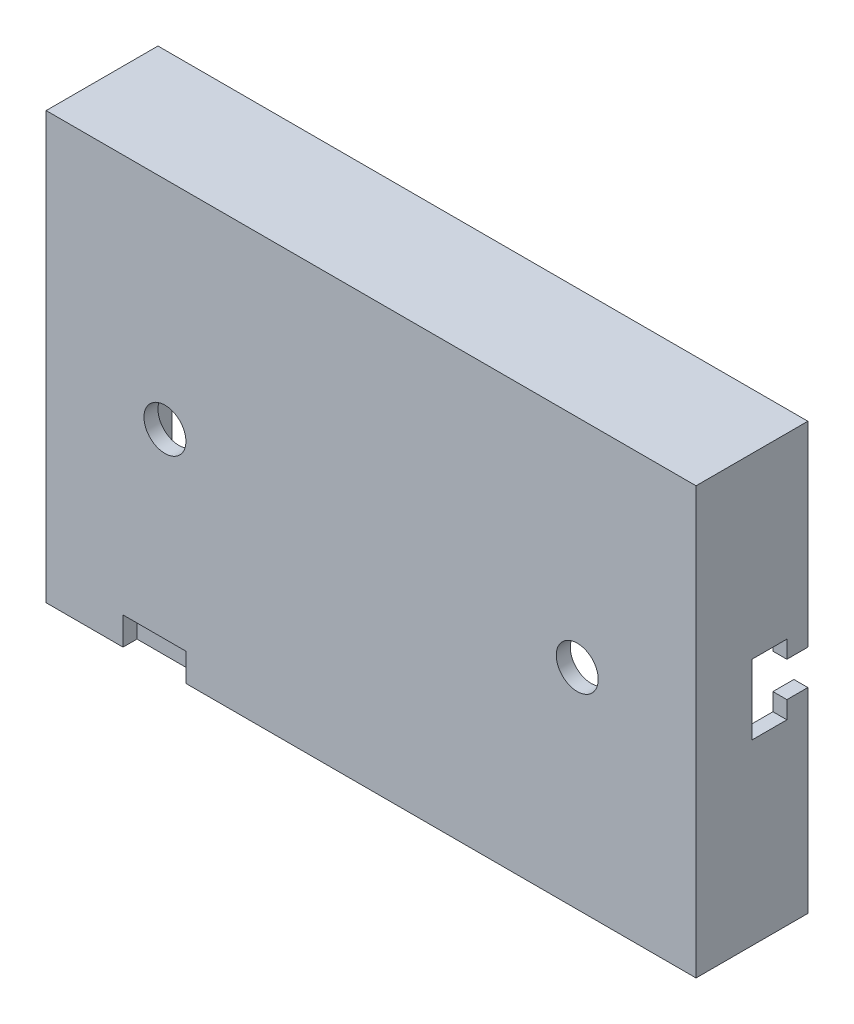
ISO-10303-21;
HEADER;
FILE_DESCRIPTION(('STEP AP214'),'2;1');
FILE_NAME('part.step','',(''),(''),'','','');
FILE_SCHEMA(('AUTOMOTIVE_DESIGN { 1 0 10303 214 1 1 1 1 }'));
ENDSEC;
DATA;
#1=APPLICATION_CONTEXT('core data for automotive mechanical design processes');
#2=APPLICATION_PROTOCOL_DEFINITION('international standard','automotive_design',2000,#1);
#3=PRODUCT_CONTEXT('',#1,'mechanical');
#4=PRODUCT('Part','Part','',(#3));
#5=PRODUCT_RELATED_PRODUCT_CATEGORY('part','',(#4));
#6=PRODUCT_DEFINITION_FORMATION('','',#4);
#7=PRODUCT_DEFINITION_CONTEXT('part definition',#1,'design');
#8=PRODUCT_DEFINITION('design','',#6,#7);
#9=PRODUCT_DEFINITION_SHAPE('','',#8);
#10=(LENGTH_UNIT() NAMED_UNIT(*) SI_UNIT(.MILLI.,.METRE.));
#11=(NAMED_UNIT(*) PLANE_ANGLE_UNIT() SI_UNIT($,.RADIAN.));
#12=(NAMED_UNIT(*) SI_UNIT($,.STERADIAN.) SOLID_ANGLE_UNIT());
#13=UNCERTAINTY_MEASURE_WITH_UNIT(LENGTH_MEASURE(1.E-05),#10,'distance_accuracy_value','');
#14=(GEOMETRIC_REPRESENTATION_CONTEXT(3) GLOBAL_UNCERTAINTY_ASSIGNED_CONTEXT((#13)) GLOBAL_UNIT_ASSIGNED_CONTEXT((#10,
#11,#12)) REPRESENTATION_CONTEXT('',''));
#15=CARTESIAN_POINT('',(0.,0.,0.));
#16=DIRECTION('',(0.,0.,1.));
#17=DIRECTION('',(1.,0.,0.));
#18=AXIS2_PLACEMENT_3D('',#15,#16,#17);
#19=CARTESIAN_POINT('',(48.6668074324324,-0.394481665967188,-11.0000011178218));
#20=DIRECTION('',(0.,0.,-1.));
#21=DIRECTION('',(0.,1.,0.));
#22=AXIS2_PLACEMENT_3D('',#19,#20,#21);
#23=PLANE('',#22);
#24=DIRECTION('',(0.,1.,0.));
#25=VECTOR('',#24,1.);
#26=CARTESIAN_POINT('',(48.6668074324324,-0.394481665967188,-11.0000011178218));
#27=LINE('',#26,#25);
#28=CARTESIAN_POINT('',(48.6668074324324,-2.89448166596719,-11.0000011178218));
#29=VERTEX_POINT('',#28);
#30=CARTESIAN_POINT('',(48.6668074324324,-0.394481665967188,-11.0000011178218));
#31=VERTEX_POINT('',#30);
#32=EDGE_CURVE('E258',#29,#31,#27,.T.);
#33=ORIENTED_EDGE('',*,*,#32,.F.);
#34=DIRECTION('',(1.,0.,0.));
#35=VECTOR('',#34,1.);
#36=CARTESIAN_POINT('',(48.6668074324324,-2.89448166596719,-11.0000011178218));
#37=LINE('',#36,#35);
#38=CARTESIAN_POINT('',(50.6668074324324,-2.89448166596719,-11.0000011178218));
#39=VERTEX_POINT('',#38);
#40=EDGE_CURVE('E235',#29,#39,#37,.T.);
#41=ORIENTED_EDGE('',*,*,#40,.T.);
#42=DIRECTION('',(0.,1.,0.));
#43=VECTOR('',#42,1.);
#44=CARTESIAN_POINT('',(50.6668074324324,-0.394481665967188,-11.0000011178218));
#45=LINE('',#44,#43);
#46=CARTESIAN_POINT('',(50.6668074324324,-0.394481665967188,-11.0000011178218));
#47=VERTEX_POINT('',#46);
#48=EDGE_CURVE('E274',#39,#47,#45,.T.);
#49=ORIENTED_EDGE('',*,*,#48,.T.);
#50=DIRECTION('',(1.,0.,0.));
#51=VECTOR('',#50,1.);
#52=CARTESIAN_POINT('',(48.6668074324324,-0.394481665967188,-11.0000011178218));
#53=LINE('',#52,#51);
#54=EDGE_CURVE('E286',#31,#47,#53,.T.);
#55=ORIENTED_EDGE('',*,*,#54,.F.);
#56=EDGE_LOOP('',(#33,#41,#49,#55));
#57=FACE_BOUND('',#56,.T.);
#58=ADVANCED_FACE('F39',(#57),#23,.F.);
#59=CARTESIAN_POINT('',(0.,0.,2.));
#60=DIRECTION('',(0.,0.,1.));
#61=DIRECTION('',(1.,0.,0.));
#62=AXIS2_PLACEMENT_3D('',#59,#60,#61);
#63=PLANE('',#62);
#64=DIRECTION('',(0.,-1.,0.));
#65=VECTOR('',#64,1.);
#66=CARTESIAN_POINT('',(-31.3331925675676,-35.8918918918919,2.));
#67=LINE('',#66,#65);
#68=CARTESIAN_POINT('',(-31.3331925675676,-31.8918918918919,2.));
#69=VERTEX_POINT('',#68);
#70=CARTESIAN_POINT('',(-31.3331925675676,-35.8918918918919,2.));
#71=VERTEX_POINT('',#70);
#72=EDGE_CURVE('E428',#69,#71,#67,.T.);
#73=ORIENTED_EDGE('',*,*,#72,.F.);
#74=DIRECTION('',(-1.,0.,0.));
#75=VECTOR('',#74,1.);
#76=CARTESIAN_POINT('',(-31.3331925675676,-31.8918918918919,2.));
#77=LINE('',#76,#75);
#78=CARTESIAN_POINT('',(-22.3331925675676,-31.8918918918919,2.));
#79=VERTEX_POINT('',#78);
#80=EDGE_CURVE('E422',#79,#69,#77,.T.);
#81=ORIENTED_EDGE('',*,*,#80,.F.);
#82=DIRECTION('',(0.,1.,0.));
#83=VECTOR('',#82,1.);
#84=CARTESIAN_POINT('',(-22.3331925675676,-35.8918918918919,2.));
#85=LINE('',#84,#83);
#86=CARTESIAN_POINT('',(-22.3331925675676,-35.8918918918919,2.));
#87=VERTEX_POINT('',#86);
#88=EDGE_CURVE('E425',#87,#79,#85,.T.);
#89=ORIENTED_EDGE('',*,*,#88,.F.);
#90=DIRECTION('',(-1.,0.,0.));
#91=VECTOR('',#90,1.);
#92=CARTESIAN_POINT('',(-42.3331925675676,-35.8918918918919,2.));
#93=LINE('',#92,#91);
#94=CARTESIAN_POINT('',(50.6668074324324,-35.8918918918919,2.));
#95=VERTEX_POINT('',#94);
#96=EDGE_CURVE('E205',#95,#87,#93,.T.);
#97=ORIENTED_EDGE('',*,*,#96,.F.);
#98=DIRECTION('',(0.,-1.,0.));
#99=VECTOR('',#98,1.);
#100=CARTESIAN_POINT('',(50.6668074324324,23.1081081081081,2.));
#101=LINE('',#100,#99);
#102=CARTESIAN_POINT('',(50.6668074324324,25.1081081081081,2.));
#103=VERTEX_POINT('',#102);
#104=EDGE_CURVE('E367',#103,#95,#101,.T.);
#105=ORIENTED_EDGE('',*,*,#104,.F.);
#106=DIRECTION('',(1.,0.,0.));
#107=VECTOR('',#106,1.);
#108=CARTESIAN_POINT('',(-42.3331925675676,25.1081081081081,2.));
#109=LINE('',#108,#107);
#110=CARTESIAN_POINT('',(-42.3331925675676,25.1081081081081,2.));
#111=VERTEX_POINT('',#110);
#112=EDGE_CURVE('E316',#111,#103,#109,.T.);
#113=ORIENTED_EDGE('',*,*,#112,.F.);
#114=DIRECTION('',(0.,1.,0.));
#115=VECTOR('',#114,1.);
#116=CARTESIAN_POINT('',(-42.3331925675676,23.1081081081081,2.));
#117=LINE('',#116,#115);
#118=CARTESIAN_POINT('',(-42.3331925675676,-35.8918918918919,2.));
#119=VERTEX_POINT('',#118);
#120=EDGE_CURVE('E350',#119,#111,#117,.T.);
#121=ORIENTED_EDGE('',*,*,#120,.F.);
#122=EDGE_CURVE('E343',#71,#119,#93,.T.);
#123=ORIENTED_EDGE('',*,*,#122,.F.);
#124=EDGE_LOOP('',(#73,#81,#89,#97,#105,#113,#121,#123));
#125=FACE_BOUND('',#124,.T.);
#126=CARTESIAN_POINT('',(33.6668074324324,-5.89189189189191,2.));
#127=DIRECTION('',(0.,0.,-1.));
#128=DIRECTION('',(-1.,0.,0.));
#129=AXIS2_PLACEMENT_3D('',#126,#127,#128);
#130=CIRCLE('',#129,3.);
#131=CARTESIAN_POINT('',(30.6668074324324,-5.89189189189191,2.));
#132=VERTEX_POINT('',#131);
#133=EDGE_CURVE('E296',#132,#132,#130,.T.);
#134=ORIENTED_EDGE('',*,*,#133,.T.);
#135=EDGE_LOOP('',(#134));
#136=FACE_BOUND('',#135,.T.);
#137=CARTESIAN_POINT('',(-25.3331925675676,-5.8918918918919,2.));
#138=DIRECTION('',(0.,0.,-1.));
#139=DIRECTION('',(-1.,0.,0.));
#140=AXIS2_PLACEMENT_3D('',#137,#138,#139);
#141=CIRCLE('',#140,3.);
#142=CARTESIAN_POINT('',(-28.3331925675676,-5.8918918918919,2.));
#143=VERTEX_POINT('',#142);
#144=EDGE_CURVE('E304',#143,#143,#141,.T.);
#145=ORIENTED_EDGE('',*,*,#144,.T.);
#146=EDGE_LOOP('',(#145));
#147=FACE_BOUND('',#146,.T.);
#148=ADVANCED_FACE('F455',(#125,#136,#147),#63,.T.);
#149=CARTESIAN_POINT('',(0.,0.,0.));
#150=DIRECTION('',(0.,0.,1.));
#151=DIRECTION('',(1.,0.,0.));
#152=AXIS2_PLACEMENT_3D('',#149,#150,#151);
#153=PLANE('',#152);
#154=CARTESIAN_POINT('',(33.6668074324324,-5.89189189189191,0.));
#155=DIRECTION('',(0.,0.,-1.));
#156=DIRECTION('',(-1.,0.,0.));
#157=AXIS2_PLACEMENT_3D('',#154,#155,#156);
#158=CIRCLE('',#157,3.);
#159=CARTESIAN_POINT('',(30.6668074324324,-5.89189189189191,0.));
#160=VERTEX_POINT('',#159);
#161=EDGE_CURVE('E285',#160,#160,#158,.T.);
#162=ORIENTED_EDGE('',*,*,#161,.F.);
#163=EDGE_LOOP('',(#162));
#164=FACE_BOUND('',#163,.T.);
#165=CARTESIAN_POINT('',(-25.3331925675676,-5.8918918918919,0.));
#166=DIRECTION('',(0.,0.,-1.));
#167=DIRECTION('',(-1.,0.,0.));
#168=AXIS2_PLACEMENT_3D('',#165,#166,#167);
#169=CIRCLE('',#168,3.);
#170=CARTESIAN_POINT('',(-28.3331925675676,-5.8918918918919,0.));
#171=VERTEX_POINT('',#170);
#172=EDGE_CURVE('E300',#171,#171,#169,.T.);
#173=ORIENTED_EDGE('',*,*,#172,.F.);
#174=EDGE_LOOP('',(#173));
#175=FACE_BOUND('',#174,.T.);
#176=DIRECTION('',(-1.,0.,0.));
#177=VECTOR('',#176,1.);
#178=CARTESIAN_POINT('',(-31.3331925675676,-31.8918918918919,0.));
#179=LINE('',#178,#177);
#180=CARTESIAN_POINT('',(-22.3331925675676,-31.8918918918919,0.));
#181=VERTEX_POINT('',#180);
#182=CARTESIAN_POINT('',(-31.3331925675676,-31.8918918918919,0.));
#183=VERTEX_POINT('',#182);
#184=EDGE_CURVE('E191',#181,#183,#179,.T.);
#185=ORIENTED_EDGE('',*,*,#184,.T.);
#186=DIRECTION('',(0.,-1.,0.));
#187=VECTOR('',#186,1.);
#188=CARTESIAN_POINT('',(-31.3331925675676,-35.8918918918919,0.));
#189=LINE('',#188,#187);
#190=CARTESIAN_POINT('',(-31.3331925675676,-33.8918918918919,0.));
#191=VERTEX_POINT('',#190);
#192=EDGE_CURVE('E199',#183,#191,#189,.T.);
#193=ORIENTED_EDGE('',*,*,#192,.T.);
#194=DIRECTION('',(1.,0.,0.));
#195=VECTOR('',#194,1.);
#196=CARTESIAN_POINT('',(-40.3331925675676,-33.8918918918919,0.));
#197=LINE('',#196,#195);
#198=CARTESIAN_POINT('',(-40.3331925675676,-33.8918918918919,0.));
#199=VERTEX_POINT('',#198);
#200=EDGE_CURVE('E391',#199,#191,#197,.T.);
#201=ORIENTED_EDGE('',*,*,#200,.F.);
#202=DIRECTION('',(0.,-1.,0.));
#203=VECTOR('',#202,1.);
#204=CARTESIAN_POINT('',(-40.3331925675676,23.1081081081081,0.));
#205=LINE('',#204,#203);
#206=CARTESIAN_POINT('',(-40.3331925675676,23.1081081081081,0.));
#207=VERTEX_POINT('',#206);
#208=EDGE_CURVE('E376',#207,#199,#205,.T.);
#209=ORIENTED_EDGE('',*,*,#208,.F.);
#210=DIRECTION('',(-1.,0.,0.));
#211=VECTOR('',#210,1.);
#212=CARTESIAN_POINT('',(-40.3331925675676,23.1081081081081,0.));
#213=LINE('',#212,#211);
#214=CARTESIAN_POINT('',(48.6668074324324,23.1081081081081,0.));
#215=VERTEX_POINT('',#214);
#216=EDGE_CURVE('E11',#215,#207,#213,.T.);
#217=ORIENTED_EDGE('',*,*,#216,.F.);
#218=DIRECTION('',(0.,1.,0.));
#219=VECTOR('',#218,1.);
#220=CARTESIAN_POINT('',(48.6668074324324,23.1081081081081,0.));
#221=LINE('',#220,#219);
#222=CARTESIAN_POINT('',(48.6668074324324,-33.8918918918919,0.));
#223=VERTEX_POINT('',#222);
#224=EDGE_CURVE('E48',#223,#215,#221,.T.);
#225=ORIENTED_EDGE('',*,*,#224,.F.);
#226=CARTESIAN_POINT('',(-22.3331925675676,-33.8918918918919,0.));
#227=VERTEX_POINT('',#226);
#228=EDGE_CURVE('E390',#227,#223,#197,.T.);
#229=ORIENTED_EDGE('',*,*,#228,.F.);
#230=DIRECTION('',(0.,1.,0.));
#231=VECTOR('',#230,1.);
#232=CARTESIAN_POINT('',(-22.3331925675676,-35.8918918918919,0.));
#233=LINE('',#232,#231);
#234=EDGE_CURVE('E188',#227,#181,#233,.T.);
#235=ORIENTED_EDGE('',*,*,#234,.T.);
#236=EDGE_LOOP('',(#185,#193,#201,#209,#217,#225,#229,#235));
#237=FACE_BOUND('',#236,.T.);
#238=ADVANCED_FACE('F41',(#164,#175,#237),#153,.F.);
#239=CARTESIAN_POINT('',(48.6668074324324,0.,0.));
#240=DIRECTION('',(1.,0.,0.));
#241=DIRECTION('',(0.,0.,-1.));
#242=AXIS2_PLACEMENT_3D('',#239,#240,#241);
#243=PLANE('',#242);
#244=DIRECTION('',(0.,1.,0.));
#245=VECTOR('',#244,1.);
#246=CARTESIAN_POINT('',(48.6668074324324,23.1081081081081,-14.));
#247=LINE('',#246,#245);
#248=CARTESIAN_POINT('',(48.6668074324324,-2.89448166596719,-14.));
#249=VERTEX_POINT('',#248);
#250=CARTESIAN_POINT('',(48.6668074324324,23.1081081081081,-14.));
#251=VERTEX_POINT('',#250);
#252=EDGE_CURVE('E380',#249,#251,#247,.T.);
#253=ORIENTED_EDGE('',*,*,#252,.F.);
#254=DIRECTION('',(0.,0.,1.));
#255=VECTOR('',#254,1.);
#256=CARTESIAN_POINT('',(48.6668074324324,-2.89448166596719,-11.0000011178218));
#257=LINE('',#256,#255);
#258=EDGE_CURVE('E225',#249,#29,#257,.T.);
#259=ORIENTED_EDGE('',*,*,#258,.T.);
#260=ORIENTED_EDGE('',*,*,#32,.T.);
#261=DIRECTION('',(0.,0.,1.));
#262=VECTOR('',#261,1.);
#263=CARTESIAN_POINT('',(48.6668074324324,-0.394481665967192,-6.00000111782184));
#264=LINE('',#263,#262);
#265=CARTESIAN_POINT('',(48.6668074324324,-0.394481665967192,-6.00000111782184));
#266=VERTEX_POINT('',#265);
#267=EDGE_CURVE('E263',#31,#266,#264,.T.);
#268=ORIENTED_EDGE('',*,*,#267,.T.);
#269=DIRECTION('',(0.,-1.,0.));
#270=VECTOR('',#269,1.);
#271=CARTESIAN_POINT('',(48.6668074324324,-0.394481665967192,-6.00000111782184));
#272=LINE('',#271,#270);
#273=CARTESIAN_POINT('',(48.6668074324324,-10.3944816659672,-6.00000111782184));
#274=VERTEX_POINT('',#273);
#275=EDGE_CURVE('E249',#266,#274,#272,.T.);
#276=ORIENTED_EDGE('',*,*,#275,.T.);
#277=DIRECTION('',(0.,0.,-1.));
#278=VECTOR('',#277,1.);
#279=CARTESIAN_POINT('',(48.6668074324324,-10.3944816659672,-6.00000111782184));
#280=LINE('',#279,#278);
#281=CARTESIAN_POINT('',(48.6668074324324,-10.3944816659672,-11.0000011178218));
#282=VERTEX_POINT('',#281);
#283=EDGE_CURVE('E253',#274,#282,#280,.T.);
#284=ORIENTED_EDGE('',*,*,#283,.T.);
#285=CARTESIAN_POINT('',(48.6668074324324,-7.89448166596719,-11.0000011178218));
#286=VERTEX_POINT('',#285);
#287=EDGE_CURVE('E259',#282,#286,#27,.T.);
#288=ORIENTED_EDGE('',*,*,#287,.T.);
#289=DIRECTION('',(0.,0.,-1.));
#290=VECTOR('',#289,1.);
#291=CARTESIAN_POINT('',(48.6668074324324,-7.89448166596719,-11.0000011178218));
#292=LINE('',#291,#290);
#293=CARTESIAN_POINT('',(48.6668074324324,-7.89448166596719,-14.));
#294=VERTEX_POINT('',#293);
#295=EDGE_CURVE('E221',#286,#294,#292,.T.);
#296=ORIENTED_EDGE('',*,*,#295,.T.);
#297=CARTESIAN_POINT('',(48.6668074324324,-33.8918918918919,-14.));
#298=VERTEX_POINT('',#297);
#299=EDGE_CURVE('E381',#298,#294,#247,.T.);
#300=ORIENTED_EDGE('',*,*,#299,.F.);
#301=DIRECTION('',(0.,0.,-1.));
#302=VECTOR('',#301,1.);
#303=CARTESIAN_POINT('',(48.6668074324324,-33.8918918918919,2.));
#304=LINE('',#303,#302);
#305=EDGE_CURVE('E357',#223,#298,#304,.T.);
#306=ORIENTED_EDGE('',*,*,#305,.F.);
#307=ORIENTED_EDGE('',*,*,#224,.T.);
#308=DIRECTION('',(0.,0.,1.));
#309=VECTOR('',#308,1.);
#310=CARTESIAN_POINT('',(48.6668074324324,23.1081081081081,2.));
#311=LINE('',#310,#309);
#312=EDGE_CURVE('E371',#251,#215,#311,.T.);
#313=ORIENTED_EDGE('',*,*,#312,.F.);
#314=EDGE_LOOP('',(#253,#259,#260,#268,#276,#284,#288,#296,#300,#306,#307,#313));
#315=FACE_BOUND('',#314,.T.);
#316=ADVANCED_FACE('F401',(#315),#243,.F.);
#317=CARTESIAN_POINT('',(50.6668074324324,23.1081081081081,-14.));
#318=DIRECTION('',(0.,0.,1.));
#319=DIRECTION('',(0.,-1.,0.));
#320=AXIS2_PLACEMENT_3D('',#317,#318,#319);
#321=PLANE('',#320);
#322=DIRECTION('',(0.,1.,0.));
#323=VECTOR('',#322,1.);
#324=CARTESIAN_POINT('',(50.6668074324324,23.1081081081081,-14.));
#325=LINE('',#324,#323);
#326=CARTESIAN_POINT('',(50.6668074324324,-2.89448166596719,-14.));
#327=VERTEX_POINT('',#326);
#328=CARTESIAN_POINT('',(50.6668074324324,25.1081081081081,-14.));
#329=VERTEX_POINT('',#328);
#330=EDGE_CURVE('E370',#327,#329,#325,.T.);
#331=ORIENTED_EDGE('',*,*,#330,.F.);
#332=DIRECTION('',(1.,0.,0.));
#333=VECTOR('',#332,1.);
#334=CARTESIAN_POINT('',(48.6668074324324,-2.89448166596719,-14.));
#335=LINE('',#334,#333);
#336=EDGE_CURVE('E240',#249,#327,#335,.T.);
#337=ORIENTED_EDGE('',*,*,#336,.F.);
#338=ORIENTED_EDGE('',*,*,#252,.T.);
#339=DIRECTION('',(-1.,0.,0.));
#340=VECTOR('',#339,1.);
#341=CARTESIAN_POINT('',(-42.3331925675676,23.1081081081081,-14.));
#342=LINE('',#341,#340);
#343=CARTESIAN_POINT('',(-40.3331925675676,23.1081081081081,-14.));
#344=VERTEX_POINT('',#343);
#345=EDGE_CURVE('E308',#251,#344,#342,.T.);
#346=ORIENTED_EDGE('',*,*,#345,.T.);
#347=DIRECTION('',(0.,-1.,0.));
#348=VECTOR('',#347,1.);
#349=CARTESIAN_POINT('',(-40.3331925675676,23.1081081081081,-14.));
#350=LINE('',#349,#348);
#351=CARTESIAN_POINT('',(-40.3331925675676,-33.8918918918919,-14.));
#352=VERTEX_POINT('',#351);
#353=EDGE_CURVE('E361',#344,#352,#350,.T.);
#354=ORIENTED_EDGE('',*,*,#353,.T.);
#355=DIRECTION('',(1.,0.,0.));
#356=VECTOR('',#355,1.);
#357=CARTESIAN_POINT('',(-42.3331925675676,-33.8918918918919,-14.));
#358=LINE('',#357,#356);
#359=EDGE_CURVE('E328',#352,#298,#358,.T.);
#360=ORIENTED_EDGE('',*,*,#359,.T.);
#361=ORIENTED_EDGE('',*,*,#299,.T.);
#362=DIRECTION('',(1.,0.,0.));
#363=VECTOR('',#362,1.);
#364=CARTESIAN_POINT('',(48.6668074324324,-7.89448166596719,-14.));
#365=LINE('',#364,#363);
#366=CARTESIAN_POINT('',(50.6668074324324,-7.89448166596719,-14.));
#367=VERTEX_POINT('',#366);
#368=EDGE_CURVE('E243',#294,#367,#365,.T.);
#369=ORIENTED_EDGE('',*,*,#368,.T.);
#370=CARTESIAN_POINT('',(50.6668074324324,-35.8918918918919,-14.));
#371=VERTEX_POINT('',#370);
#372=EDGE_CURVE('E372',#371,#367,#325,.T.);
#373=ORIENTED_EDGE('',*,*,#372,.F.);
#374=DIRECTION('',(1.,0.,0.));
#375=VECTOR('',#374,1.);
#376=CARTESIAN_POINT('',(-42.3331925675676,-35.8918918918919,-14.));
#377=LINE('',#376,#375);
#378=CARTESIAN_POINT('',(-42.3331925675676,-35.8918918918919,-14.));
#379=VERTEX_POINT('',#378);
#380=EDGE_CURVE('E336',#379,#371,#377,.T.);
#381=ORIENTED_EDGE('',*,*,#380,.F.);
#382=DIRECTION('',(0.,-1.,0.));
#383=VECTOR('',#382,1.);
#384=CARTESIAN_POINT('',(-42.3331925675676,23.1081081081081,-14.));
#385=LINE('',#384,#383);
#386=CARTESIAN_POINT('',(-42.3331925675676,25.1081081081081,-14.));
#387=VERTEX_POINT('',#386);
#388=EDGE_CURVE('E353',#387,#379,#385,.T.);
#389=ORIENTED_EDGE('',*,*,#388,.F.);
#390=DIRECTION('',(-1.,0.,0.));
#391=VECTOR('',#390,1.);
#392=CARTESIAN_POINT('',(-42.3331925675676,25.1081081081081,-14.));
#393=LINE('',#392,#391);
#394=EDGE_CURVE('E324',#329,#387,#393,.T.);
#395=ORIENTED_EDGE('',*,*,#394,.F.);
#396=EDGE_LOOP('',(#331,#337,#338,#346,#354,#360,#361,#369,#373,#381,#389,#395));
#397=FACE_BOUND('',#396,.T.);
#398=ADVANCED_FACE('F411',(#397),#321,.F.);
#399=CARTESIAN_POINT('',(50.6668074324324,0.,0.));
#400=DIRECTION('',(1.,0.,0.));
#401=DIRECTION('',(0.,0.,-1.));
#402=AXIS2_PLACEMENT_3D('',#399,#400,#401);
#403=PLANE('',#402);
#404=DIRECTION('',(0.,0.,1.));
#405=VECTOR('',#404,1.);
#406=CARTESIAN_POINT('',(50.6668074324324,-2.89448166596719,-11.0000011178218));
#407=LINE('',#406,#405);
#408=EDGE_CURVE('E226',#327,#39,#407,.T.);
#409=ORIENTED_EDGE('',*,*,#408,.F.);
#410=ORIENTED_EDGE('',*,*,#330,.T.);
#411=DIRECTION('',(0.,0.,-1.));
#412=VECTOR('',#411,1.);
#413=CARTESIAN_POINT('',(50.6668074324324,25.1081081081081,-14.));
#414=LINE('',#413,#412);
#415=EDGE_CURVE('E320',#103,#329,#414,.T.);
#416=ORIENTED_EDGE('',*,*,#415,.F.);
#417=ORIENTED_EDGE('',*,*,#104,.T.);
#418=DIRECTION('',(0.,0.,1.));
#419=VECTOR('',#418,1.);
#420=CARTESIAN_POINT('',(50.6668074324324,-35.8918918918919,2.));
#421=LINE('',#420,#419);
#422=EDGE_CURVE('E340',#371,#95,#421,.T.);
#423=ORIENTED_EDGE('',*,*,#422,.F.);
#424=ORIENTED_EDGE('',*,*,#372,.T.);
#425=DIRECTION('',(0.,0.,-1.));
#426=VECTOR('',#425,1.);
#427=CARTESIAN_POINT('',(50.6668074324324,-7.89448166596719,-11.0000011178218));
#428=LINE('',#427,#426);
#429=CARTESIAN_POINT('',(50.6668074324324,-7.89448166596719,-11.0000011178218));
#430=VERTEX_POINT('',#429);
#431=EDGE_CURVE('E220',#430,#367,#428,.T.);
#432=ORIENTED_EDGE('',*,*,#431,.F.);
#433=CARTESIAN_POINT('',(50.6668074324324,-10.3944816659672,-11.0000011178218));
#434=VERTEX_POINT('',#433);
#435=EDGE_CURVE('E275',#434,#430,#45,.T.);
#436=ORIENTED_EDGE('',*,*,#435,.F.);
#437=DIRECTION('',(0.,0.,-1.));
#438=VECTOR('',#437,1.);
#439=CARTESIAN_POINT('',(50.6668074324324,-10.3944816659672,-6.00000111782184));
#440=LINE('',#439,#438);
#441=CARTESIAN_POINT('',(50.6668074324324,-10.3944816659672,-6.00000111782184));
#442=VERTEX_POINT('',#441);
#443=EDGE_CURVE('E270',#442,#434,#440,.T.);
#444=ORIENTED_EDGE('',*,*,#443,.F.);
#445=DIRECTION('',(0.,-1.,0.));
#446=VECTOR('',#445,1.);
#447=CARTESIAN_POINT('',(50.6668074324324,-0.394481665967192,-6.00000111782184));
#448=LINE('',#447,#446);
#449=CARTESIAN_POINT('',(50.6668074324324,-0.394481665967192,-6.00000111782184));
#450=VERTEX_POINT('',#449);
#451=EDGE_CURVE('E239',#450,#442,#448,.T.);
#452=ORIENTED_EDGE('',*,*,#451,.F.);
#453=DIRECTION('',(0.,0.,1.));
#454=VECTOR('',#453,1.);
#455=CARTESIAN_POINT('',(50.6668074324324,-0.394481665967192,-6.00000111782184));
#456=LINE('',#455,#454);
#457=EDGE_CURVE('E254',#47,#450,#456,.T.);
#458=ORIENTED_EDGE('',*,*,#457,.F.);
#459=ORIENTED_EDGE('',*,*,#48,.F.);
#460=EDGE_LOOP('',(#409,#410,#416,#417,#423,#424,#432,#436,#444,#452,#458,#459));
#461=FACE_BOUND('',#460,.T.);
#462=ADVANCED_FACE('F450',(#461),#403,.T.);
#463=CARTESIAN_POINT('',(-42.3331925675676,0.,0.));
#464=DIRECTION('',(1.,0.,0.));
#465=DIRECTION('',(0.,1.,0.));
#466=AXIS2_PLACEMENT_3D('',#463,#464,#465);
#467=PLANE('',#466);
#468=ORIENTED_EDGE('',*,*,#120,.T.);
#469=DIRECTION('',(0.,0.,1.));
#470=VECTOR('',#469,1.);
#471=CARTESIAN_POINT('',(-42.3331925675676,25.1081081081081,-14.));
#472=LINE('',#471,#470);
#473=EDGE_CURVE('E312',#387,#111,#472,.T.);
#474=ORIENTED_EDGE('',*,*,#473,.F.);
#475=ORIENTED_EDGE('',*,*,#388,.T.);
#476=DIRECTION('',(0.,0.,-1.));
#477=VECTOR('',#476,1.);
#478=CARTESIAN_POINT('',(-42.3331925675676,-35.8918918918919,2.));
#479=LINE('',#478,#477);
#480=EDGE_CURVE('E332',#119,#379,#479,.T.);
#481=ORIENTED_EDGE('',*,*,#480,.F.);
#482=EDGE_LOOP('',(#468,#474,#475,#481));
#483=FACE_BOUND('',#482,.T.);
#484=ADVANCED_FACE('F443',(#483),#467,.F.);
#485=CARTESIAN_POINT('',(-40.3331925675676,0.,0.));
#486=DIRECTION('',(1.,0.,0.));
#487=DIRECTION('',(0.,1.,0.));
#488=AXIS2_PLACEMENT_3D('',#485,#486,#487);
#489=PLANE('',#488);
#490=DIRECTION('',(0.,0.,-1.));
#491=VECTOR('',#490,1.);
#492=CARTESIAN_POINT('',(-40.3331925675676,23.1081081081081,2.));
#493=LINE('',#492,#491);
#494=EDGE_CURVE('E346',#207,#344,#493,.T.);
#495=ORIENTED_EDGE('',*,*,#494,.F.);
#496=ORIENTED_EDGE('',*,*,#208,.T.);
#497=DIRECTION('',(0.,0.,1.));
#498=VECTOR('',#497,1.);
#499=CARTESIAN_POINT('',(-40.3331925675676,-33.8918918918919,2.));
#500=LINE('',#499,#498);
#501=EDGE_CURVE('E354',#352,#199,#500,.T.);
#502=ORIENTED_EDGE('',*,*,#501,.F.);
#503=ORIENTED_EDGE('',*,*,#353,.F.);
#504=EDGE_LOOP('',(#495,#496,#502,#503));
#505=FACE_BOUND('',#504,.T.);
#506=ADVANCED_FACE('F441',(#505),#489,.T.);
#507=CARTESIAN_POINT('',(0.,-33.8918918918919,0.));
#508=DIRECTION('',(0.,-1.,0.));
#509=DIRECTION('',(0.,0.,-1.));
#510=AXIS2_PLACEMENT_3D('',#507,#508,#509);
#511=PLANE('',#510);
#512=ORIENTED_EDGE('',*,*,#200,.T.);
#513=DIRECTION('',(1.,0.,0.));
#514=VECTOR('',#513,1.);
#515=CARTESIAN_POINT('',(0.,-33.8918918918919,0.));
#516=LINE('',#515,#514);
#517=EDGE_CURVE('E216',#191,#227,#516,.T.);
#518=ORIENTED_EDGE('',*,*,#517,.T.);
#519=ORIENTED_EDGE('',*,*,#228,.T.);
#520=ORIENTED_EDGE('',*,*,#305,.T.);
#521=ORIENTED_EDGE('',*,*,#359,.F.);
#522=ORIENTED_EDGE('',*,*,#501,.T.);
#523=EDGE_LOOP('',(#512,#518,#519,#520,#521,#522));
#524=FACE_BOUND('',#523,.T.);
#525=ADVANCED_FACE('F438',(#524),#511,.F.);
#526=CARTESIAN_POINT('',(0.,-35.8918918918919,0.));
#527=DIRECTION('',(0.,-1.,0.));
#528=DIRECTION('',(0.,0.,-1.));
#529=AXIS2_PLACEMENT_3D('',#526,#527,#528);
#530=PLANE('',#529);
#531=DIRECTION('',(0.,0.,1.));
#532=VECTOR('',#531,1.);
#533=CARTESIAN_POINT('',(-31.3331925675676,-35.8918918918919,0.));
#534=LINE('',#533,#532);
#535=CARTESIAN_POINT('',(-31.3331925675676,-35.8918918918919,0.));
#536=VERTEX_POINT('',#535);
#537=EDGE_CURVE('E63',#536,#71,#534,.T.);
#538=ORIENTED_EDGE('',*,*,#537,.T.);
#539=ORIENTED_EDGE('',*,*,#122,.T.);
#540=ORIENTED_EDGE('',*,*,#480,.T.);
#541=ORIENTED_EDGE('',*,*,#380,.T.);
#542=ORIENTED_EDGE('',*,*,#422,.T.);
#543=ORIENTED_EDGE('',*,*,#96,.T.);
#544=DIRECTION('',(0.,0.,1.));
#545=VECTOR('',#544,1.);
#546=CARTESIAN_POINT('',(-22.3331925675676,-35.8918918918919,0.));
#547=LINE('',#546,#545);
#548=CARTESIAN_POINT('',(-22.3331925675676,-35.8918918918919,0.));
#549=VERTEX_POINT('',#548);
#550=EDGE_CURVE('E185',#549,#87,#547,.T.);
#551=ORIENTED_EDGE('',*,*,#550,.F.);
#552=DIRECTION('',(1.,0.,0.));
#553=VECTOR('',#552,1.);
#554=CARTESIAN_POINT('',(-31.3331925675676,-35.8918918918919,0.));
#555=LINE('',#554,#553);
#556=EDGE_CURVE('E194',#536,#549,#555,.T.);
#557=ORIENTED_EDGE('',*,*,#556,.F.);
#558=EDGE_LOOP('',(#538,#539,#540,#541,#542,#543,#551,#557));
#559=FACE_BOUND('',#558,.T.);
#560=ADVANCED_FACE('F202',(#559),#530,.T.);
#561=CARTESIAN_POINT('',(0.,23.1081081081081,0.));
#562=DIRECTION('',(0.,1.,0.));
#563=DIRECTION('',(0.,0.,1.));
#564=AXIS2_PLACEMENT_3D('',#561,#562,#563);
#565=PLANE('',#564);
#566=ORIENTED_EDGE('',*,*,#216,.T.);
#567=ORIENTED_EDGE('',*,*,#494,.T.);
#568=ORIENTED_EDGE('',*,*,#345,.F.);
#569=ORIENTED_EDGE('',*,*,#312,.T.);
#570=EDGE_LOOP('',(#566,#567,#568,#569));
#571=FACE_BOUND('',#570,.T.);
#572=ADVANCED_FACE('F408',(#571),#565,.F.);
#573=CARTESIAN_POINT('',(0.,25.1081081081081,0.));
#574=DIRECTION('',(0.,1.,0.));
#575=DIRECTION('',(0.,0.,1.));
#576=AXIS2_PLACEMENT_3D('',#573,#574,#575);
#577=PLANE('',#576);
#578=ORIENTED_EDGE('',*,*,#473,.T.);
#579=ORIENTED_EDGE('',*,*,#112,.T.);
#580=ORIENTED_EDGE('',*,*,#415,.T.);
#581=ORIENTED_EDGE('',*,*,#394,.T.);
#582=EDGE_LOOP('',(#578,#579,#580,#581));
#583=FACE_BOUND('',#582,.T.);
#584=ADVANCED_FACE('F495',(#583),#577,.T.);
#585=CARTESIAN_POINT('',(-25.3331925675676,-5.8918918918919,2.));
#586=DIRECTION('',(0.,0.,-1.));
#587=DIRECTION('',(-1.,0.,0.));
#588=AXIS2_PLACEMENT_3D('',#585,#586,#587);
#589=CYLINDRICAL_SURFACE('',#588,3.);
#590=ORIENTED_EDGE('',*,*,#144,.F.);
#591=EDGE_LOOP('',(#590));
#592=FACE_BOUND('',#591,.T.);
#593=ORIENTED_EDGE('',*,*,#172,.T.);
#594=EDGE_LOOP('',(#593));
#595=FACE_BOUND('',#594,.T.);
#596=ADVANCED_FACE('F634',(#592,#595),#589,.F.);
#597=CARTESIAN_POINT('',(33.6668074324324,-5.89189189189191,2.));
#598=DIRECTION('',(0.,0.,-1.));
#599=DIRECTION('',(-1.,0.,0.));
#600=AXIS2_PLACEMENT_3D('',#597,#598,#599);
#601=CYLINDRICAL_SURFACE('',#600,3.);
#602=ORIENTED_EDGE('',*,*,#133,.F.);
#603=EDGE_LOOP('',(#602));
#604=FACE_BOUND('',#603,.T.);
#605=ORIENTED_EDGE('',*,*,#161,.T.);
#606=EDGE_LOOP('',(#605));
#607=FACE_BOUND('',#606,.T.);
#608=ADVANCED_FACE('F642',(#604,#607),#601,.F.);
#609=CARTESIAN_POINT('',(48.6668074324324,-0.394481665967192,-6.00000111782184));
#610=DIRECTION('',(0.,0.,1.));
#611=DIRECTION('',(0.,-1.,0.));
#612=AXIS2_PLACEMENT_3D('',#609,#610,#611);
#613=PLANE('',#612);
#614=ORIENTED_EDGE('',*,*,#451,.T.);
#615=DIRECTION('',(1.,0.,0.));
#616=VECTOR('',#615,1.);
#617=CARTESIAN_POINT('',(48.6668074324324,-10.3944816659672,-6.00000111782184));
#618=LINE('',#617,#616);
#619=EDGE_CURVE('E267',#274,#442,#618,.T.);
#620=ORIENTED_EDGE('',*,*,#619,.F.);
#621=ORIENTED_EDGE('',*,*,#275,.F.);
#622=DIRECTION('',(1.,0.,0.));
#623=VECTOR('',#622,1.);
#624=CARTESIAN_POINT('',(48.6668074324324,-0.394481665967192,-6.00000111782184));
#625=LINE('',#624,#623);
#626=EDGE_CURVE('E282',#266,#450,#625,.T.);
#627=ORIENTED_EDGE('',*,*,#626,.T.);
#628=EDGE_LOOP('',(#614,#620,#621,#627));
#629=FACE_BOUND('',#628,.T.);
#630=ADVANCED_FACE('F476',(#629),#613,.F.);
#631=CARTESIAN_POINT('',(48.6668074324324,-0.394481665967192,-6.00000111782184));
#632=DIRECTION('',(0.,1.,0.));
#633=DIRECTION('',(0.,0.,1.));
#634=AXIS2_PLACEMENT_3D('',#631,#632,#633);
#635=PLANE('',#634);
#636=ORIENTED_EDGE('',*,*,#457,.T.);
#637=ORIENTED_EDGE('',*,*,#626,.F.);
#638=ORIENTED_EDGE('',*,*,#267,.F.);
#639=ORIENTED_EDGE('',*,*,#54,.T.);
#640=EDGE_LOOP('',(#636,#637,#638,#639));
#641=FACE_BOUND('',#640,.T.);
#642=ADVANCED_FACE('F468',(#641),#635,.F.);
#643=ORIENTED_EDGE('',*,*,#435,.T.);
#644=DIRECTION('',(1.,0.,0.));
#645=VECTOR('',#644,1.);
#646=CARTESIAN_POINT('',(48.6668074324324,-7.89448166596719,-11.0000011178218));
#647=LINE('',#646,#645);
#648=EDGE_CURVE('E230',#286,#430,#647,.T.);
#649=ORIENTED_EDGE('',*,*,#648,.F.);
#650=ORIENTED_EDGE('',*,*,#287,.F.);
#651=DIRECTION('',(1.,0.,0.));
#652=VECTOR('',#651,1.);
#653=CARTESIAN_POINT('',(48.6668074324324,-10.3944816659672,-11.0000011178218));
#654=LINE('',#653,#652);
#655=EDGE_CURVE('E290',#282,#434,#654,.T.);
#656=ORIENTED_EDGE('',*,*,#655,.T.);
#657=EDGE_LOOP('',(#643,#649,#650,#656));
#658=FACE_BOUND('',#657,.T.);
#659=ADVANCED_FACE('F458',(#658),#23,.F.);
#660=CARTESIAN_POINT('',(48.6668074324324,-10.3944816659672,-6.00000111782184));
#661=DIRECTION('',(0.,-1.,0.));
#662=DIRECTION('',(0.,0.,-1.));
#663=AXIS2_PLACEMENT_3D('',#660,#661,#662);
#664=PLANE('',#663);
#665=ORIENTED_EDGE('',*,*,#443,.T.);
#666=ORIENTED_EDGE('',*,*,#655,.F.);
#667=ORIENTED_EDGE('',*,*,#283,.F.);
#668=ORIENTED_EDGE('',*,*,#619,.T.);
#669=EDGE_LOOP('',(#665,#666,#667,#668));
#670=FACE_BOUND('',#669,.T.);
#671=ADVANCED_FACE('F467',(#670),#664,.F.);
#672=CARTESIAN_POINT('',(48.6668074324324,-7.89448166596719,-11.0000011178218));
#673=DIRECTION('',(0.,-1.,0.));
#674=DIRECTION('',(0.,0.,-1.));
#675=AXIS2_PLACEMENT_3D('',#672,#673,#674);
#676=PLANE('',#675);
#677=ORIENTED_EDGE('',*,*,#431,.T.);
#678=ORIENTED_EDGE('',*,*,#368,.F.);
#679=ORIENTED_EDGE('',*,*,#295,.F.);
#680=ORIENTED_EDGE('',*,*,#648,.T.);
#681=EDGE_LOOP('',(#677,#678,#679,#680));
#682=FACE_BOUND('',#681,.T.);
#683=ADVANCED_FACE('F474',(#682),#676,.F.);
#684=CARTESIAN_POINT('',(48.6668074324324,-2.89448166596719,-11.0000011178218));
#685=DIRECTION('',(0.,1.,0.));
#686=DIRECTION('',(0.,0.,1.));
#687=AXIS2_PLACEMENT_3D('',#684,#685,#686);
#688=PLANE('',#687);
#689=ORIENTED_EDGE('',*,*,#408,.T.);
#690=ORIENTED_EDGE('',*,*,#40,.F.);
#691=ORIENTED_EDGE('',*,*,#258,.F.);
#692=ORIENTED_EDGE('',*,*,#336,.T.);
#693=EDGE_LOOP('',(#689,#690,#691,#692));
#694=FACE_BOUND('',#693,.T.);
#695=ADVANCED_FACE('F514',(#694),#688,.F.);
#696=CARTESIAN_POINT('',(0.,0.,0.));
#697=DIRECTION('',(0.,0.,-1.));
#698=DIRECTION('',(-1.,0.,0.));
#699=AXIS2_PLACEMENT_3D('',#696,#697,#698);
#700=PLANE('',#699);
#701=EDGE_CURVE('E196',#191,#536,#189,.T.);
#702=ORIENTED_EDGE('',*,*,#701,.T.);
#703=ORIENTED_EDGE('',*,*,#556,.T.);
#704=EDGE_CURVE('E55',#549,#227,#233,.T.);
#705=ORIENTED_EDGE('',*,*,#704,.T.);
#706=ORIENTED_EDGE('',*,*,#517,.F.);
#707=EDGE_LOOP('',(#702,#703,#705,#706));
#708=FACE_BOUND('',#707,.T.);
#709=ADVANCED_FACE('F195',(#708),#700,.F.);
#710=CARTESIAN_POINT('',(-31.3331925675676,-35.8918918918919,0.));
#711=DIRECTION('',(-1.,0.,0.));
#712=DIRECTION('',(0.,0.,1.));
#713=AXIS2_PLACEMENT_3D('',#710,#711,#712);
#714=PLANE('',#713);
#715=ORIENTED_EDGE('',*,*,#72,.T.);
#716=ORIENTED_EDGE('',*,*,#537,.F.);
#717=ORIENTED_EDGE('',*,*,#701,.F.);
#718=ORIENTED_EDGE('',*,*,#192,.F.);
#719=DIRECTION('',(0.,0.,1.));
#720=VECTOR('',#719,1.);
#721=CARTESIAN_POINT('',(-31.3331925675676,-31.8918918918919,0.));
#722=LINE('',#721,#720);
#723=EDGE_CURVE('E211',#183,#69,#722,.T.);
#724=ORIENTED_EDGE('',*,*,#723,.T.);
#725=EDGE_LOOP('',(#715,#716,#717,#718,#724));
#726=FACE_BOUND('',#725,.T.);
#727=ADVANCED_FACE('F504',(#726),#714,.F.);
#728=CARTESIAN_POINT('',(-31.3331925675676,-31.8918918918919,0.));
#729=DIRECTION('',(0.,1.,0.));
#730=DIRECTION('',(0.,0.,1.));
#731=AXIS2_PLACEMENT_3D('',#728,#729,#730);
#732=PLANE('',#731);
#733=ORIENTED_EDGE('',*,*,#80,.T.);
#734=ORIENTED_EDGE('',*,*,#723,.F.);
#735=ORIENTED_EDGE('',*,*,#184,.F.);
#736=DIRECTION('',(0.,0.,1.));
#737=VECTOR('',#736,1.);
#738=CARTESIAN_POINT('',(-22.3331925675676,-31.8918918918919,0.));
#739=LINE('',#738,#737);
#740=EDGE_CURVE('E207',#181,#79,#739,.T.);
#741=ORIENTED_EDGE('',*,*,#740,.T.);
#742=EDGE_LOOP('',(#733,#734,#735,#741));
#743=FACE_BOUND('',#742,.T.);
#744=ADVANCED_FACE('F506',(#743),#732,.F.);
#745=CARTESIAN_POINT('',(-22.3331925675676,-35.8918918918919,0.));
#746=DIRECTION('',(1.,0.,0.));
#747=DIRECTION('',(0.,0.,-1.));
#748=AXIS2_PLACEMENT_3D('',#745,#746,#747);
#749=PLANE('',#748);
#750=ORIENTED_EDGE('',*,*,#88,.T.);
#751=ORIENTED_EDGE('',*,*,#740,.F.);
#752=ORIENTED_EDGE('',*,*,#234,.F.);
#753=ORIENTED_EDGE('',*,*,#704,.F.);
#754=ORIENTED_EDGE('',*,*,#550,.T.);
#755=EDGE_LOOP('',(#750,#751,#752,#753,#754));
#756=FACE_BOUND('',#755,.T.);
#757=ADVANCED_FACE('F183',(#756),#749,.F.);
#758=CLOSED_SHELL('',(#58,#148,#238,#316,#398,#462,#484,#506,#525,#560,#572,#584,#596,#608,#630,
#642,#659,#671,#683,#695,#709,#727,#744,#757));
#759=MANIFOLD_SOLID_BREP('B2',#758);
#760=ADVANCED_BREP_SHAPE_REPRESENTATION('',(#18,#759),#14);
#761=SHAPE_DEFINITION_REPRESENTATION(#9,#760);
ENDSEC;
END-ISO-10303-21;
